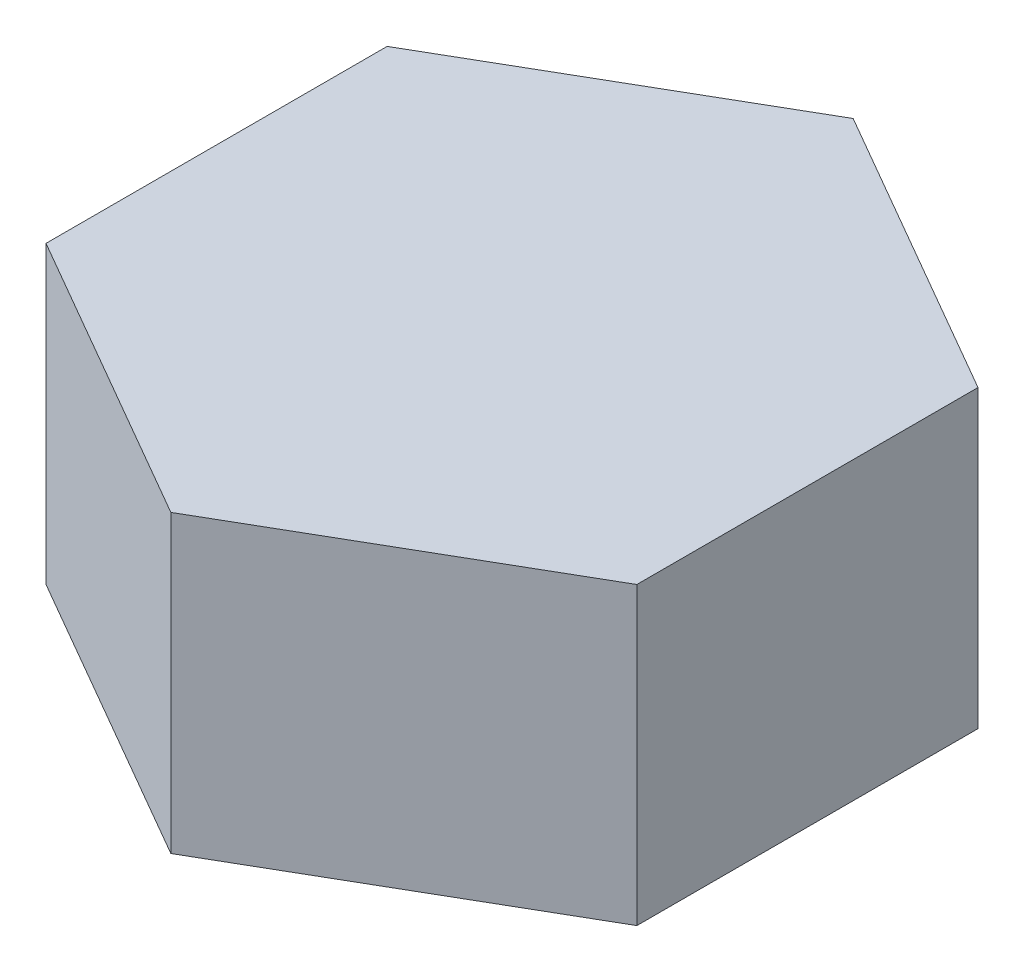
ISO-10303-21;
HEADER;
FILE_DESCRIPTION(('STEP AP214'),'2;1');
FILE_NAME('part.step','',(''),(''),'','','');
FILE_SCHEMA(('AUTOMOTIVE_DESIGN { 1 0 10303 214 1 1 1 1 }'));
ENDSEC;
DATA;
#1=APPLICATION_CONTEXT('core data for automotive mechanical design processes');
#2=APPLICATION_PROTOCOL_DEFINITION('international standard','automotive_design',2000,#1);
#3=PRODUCT_CONTEXT('',#1,'mechanical');
#4=PRODUCT('Part','Part','',(#3));
#5=PRODUCT_RELATED_PRODUCT_CATEGORY('part','',(#4));
#6=PRODUCT_DEFINITION_FORMATION('','',#4);
#7=PRODUCT_DEFINITION_CONTEXT('part definition',#1,'design');
#8=PRODUCT_DEFINITION('design','',#6,#7);
#9=PRODUCT_DEFINITION_SHAPE('','',#8);
#10=(LENGTH_UNIT() NAMED_UNIT(*) SI_UNIT(.MILLI.,.METRE.));
#11=(NAMED_UNIT(*) PLANE_ANGLE_UNIT() SI_UNIT($,.RADIAN.));
#12=(NAMED_UNIT(*) SI_UNIT($,.STERADIAN.) SOLID_ANGLE_UNIT());
#13=UNCERTAINTY_MEASURE_WITH_UNIT(LENGTH_MEASURE(1.E-05),#10,'distance_accuracy_value','');
#14=(GEOMETRIC_REPRESENTATION_CONTEXT(3) GLOBAL_UNCERTAINTY_ASSIGNED_CONTEXT((#13)) GLOBAL_UNIT_ASSIGNED_CONTEXT((#10,
#11,#12)) REPRESENTATION_CONTEXT('',''));
#15=CARTESIAN_POINT('',(0.,0.,0.));
#16=DIRECTION('',(0.,0.,1.));
#17=DIRECTION('',(1.,0.,0.));
#18=AXIS2_PLACEMENT_3D('',#15,#16,#17);
#19=CARTESIAN_POINT('',(50.7999999999998,50.8,29.3293936748337));
#20=DIRECTION('',(-1.,0.,0.));
#21=DIRECTION('',(0.,0.,1.));
#22=AXIS2_PLACEMENT_3D('',#19,#20,#21);
#23=PLANE('',#22);
#24=DIRECTION('',(0.,0.,-1.));
#25=VECTOR('',#24,1.);
#26=CARTESIAN_POINT('',(50.7999999999998,0.,29.3293936748337));
#27=LINE('',#26,#25);
#28=CARTESIAN_POINT('',(50.7999999999998,0.,29.3293936748337));
#29=VERTEX_POINT('',#28);
#30=CARTESIAN_POINT('',(50.8000000000006,0.,-29.3293936748325));
#31=VERTEX_POINT('',#30);
#32=EDGE_CURVE('E117',#29,#31,#27,.T.);
#33=ORIENTED_EDGE('',*,*,#32,.T.);
#34=DIRECTION('',(0.,-1.,0.));
#35=VECTOR('',#34,1.);
#36=CARTESIAN_POINT('',(50.8000000000006,50.8,-29.3293936748325));
#37=LINE('',#36,#35);
#38=CARTESIAN_POINT('',(50.8000000000006,50.8,-29.3293936748325));
#39=VERTEX_POINT('',#38);
#40=EDGE_CURVE('E11',#39,#31,#37,.T.);
#41=ORIENTED_EDGE('',*,*,#40,.F.);
#42=DIRECTION('',(0.,0.,-1.));
#43=VECTOR('',#42,1.);
#44=CARTESIAN_POINT('',(50.7999999999998,50.8,29.3293936748337));
#45=LINE('',#44,#43);
#46=CARTESIAN_POINT('',(50.7999999999998,50.8,29.3293936748337));
#47=VERTEX_POINT('',#46);
#48=EDGE_CURVE('E127',#47,#39,#45,.T.);
#49=ORIENTED_EDGE('',*,*,#48,.F.);
#50=DIRECTION('',(0.,-1.,0.));
#51=VECTOR('',#50,1.);
#52=CARTESIAN_POINT('',(50.7999999999998,50.8,29.3293936748337));
#53=LINE('',#52,#51);
#54=EDGE_CURVE('E113',#47,#29,#53,.T.);
#55=ORIENTED_EDGE('',*,*,#54,.T.);
#56=EDGE_LOOP('',(#33,#41,#49,#55));
#57=FACE_BOUND('',#56,.T.);
#58=ADVANCED_FACE('F33',(#57),#23,.F.);
#59=CARTESIAN_POINT('',(50.8000000000006,50.8,-29.3293936748325));
#60=DIRECTION('',(-0.500000000000011,0.,0.866025403784432));
#61=DIRECTION('',(0.866025403784433,0.,0.500000000000011));
#62=AXIS2_PLACEMENT_3D('',#59,#60,#61);
#63=PLANE('',#62);
#64=DIRECTION('',(-0.866025403784432,0.,-0.500000000000011));
#65=VECTOR('',#64,1.);
#66=CARTESIAN_POINT('',(50.8000000000006,0.,-29.3293936748325));
#67=LINE('',#66,#65);
#68=CARTESIAN_POINT('',(7.33001983763137E-13,0.,-58.6587873496662));
#69=VERTEX_POINT('',#68);
#70=EDGE_CURVE('E120',#31,#69,#67,.T.);
#71=ORIENTED_EDGE('',*,*,#70,.T.);
#72=DIRECTION('',(0.,-1.,0.));
#73=VECTOR('',#72,1.);
#74=CARTESIAN_POINT('',(7.33001983763137E-13,50.8,-58.6587873496662));
#75=LINE('',#74,#73);
#76=CARTESIAN_POINT('',(7.33001983763137E-13,50.8,-58.6587873496662));
#77=VERTEX_POINT('',#76);
#78=EDGE_CURVE('E41',#77,#69,#75,.T.);
#79=ORIENTED_EDGE('',*,*,#78,.F.);
#80=DIRECTION('',(-0.866025403784432,0.,-0.500000000000011));
#81=VECTOR('',#80,1.);
#82=CARTESIAN_POINT('',(50.8000000000006,50.8,-29.3293936748325));
#83=LINE('',#82,#81);
#84=EDGE_CURVE('E86',#39,#77,#83,.T.);
#85=ORIENTED_EDGE('',*,*,#84,.F.);
#86=ORIENTED_EDGE('',*,*,#40,.T.);
#87=EDGE_LOOP('',(#71,#79,#85,#86));
#88=FACE_BOUND('',#87,.T.);
#89=ADVANCED_FACE('F151',(#88),#63,.F.);
#90=CARTESIAN_POINT('',(7.33001983763137E-13,50.8,-58.6587873496662));
#91=DIRECTION('',(0.499999999999989,0.,0.866025403784445));
#92=DIRECTION('',(0.866025403784445,0.,-0.499999999999989));
#93=AXIS2_PLACEMENT_3D('',#90,#91,#92);
#94=PLANE('',#93);
#95=DIRECTION('',(-0.866025403784445,0.,0.499999999999989));
#96=VECTOR('',#95,1.);
#97=CARTESIAN_POINT('',(7.33001983763137E-13,0.,-58.6587873496662));
#98=LINE('',#97,#96);
#99=CARTESIAN_POINT('',(-50.7999999999998,0.,-29.3293936748338));
#100=VERTEX_POINT('',#99);
#101=EDGE_CURVE('E122',#69,#100,#98,.T.);
#102=ORIENTED_EDGE('',*,*,#101,.T.);
#103=DIRECTION('',(0.,-1.,0.));
#104=VECTOR('',#103,1.);
#105=CARTESIAN_POINT('',(-50.7999999999998,50.8,-29.3293936748338));
#106=LINE('',#105,#104);
#107=CARTESIAN_POINT('',(-50.7999999999998,50.8,-29.3293936748338));
#108=VERTEX_POINT('',#107);
#109=EDGE_CURVE('E108',#108,#100,#106,.T.);
#110=ORIENTED_EDGE('',*,*,#109,.F.);
#111=DIRECTION('',(-0.866025403784445,0.,0.499999999999989));
#112=VECTOR('',#111,1.);
#113=CARTESIAN_POINT('',(7.33001983763137E-13,50.8,-58.6587873496662));
#114=LINE('',#113,#112);
#115=EDGE_CURVE('E99',#77,#108,#114,.T.);
#116=ORIENTED_EDGE('',*,*,#115,.F.);
#117=ORIENTED_EDGE('',*,*,#78,.T.);
#118=EDGE_LOOP('',(#102,#110,#116,#117));
#119=FACE_BOUND('',#118,.T.);
#120=ADVANCED_FACE('F133',(#119),#94,.F.);
#121=CARTESIAN_POINT('',(-50.7999999999998,50.8,-29.3293936748338));
#122=DIRECTION('',(1.,0.,0.));
#123=DIRECTION('',(0.,0.,-1.));
#124=AXIS2_PLACEMENT_3D('',#121,#122,#123);
#125=PLANE('',#124);
#126=DIRECTION('',(0.,0.,1.));
#127=VECTOR('',#126,1.);
#128=CARTESIAN_POINT('',(-50.7999999999998,0.,-29.3293936748338));
#129=LINE('',#128,#127);
#130=CARTESIAN_POINT('',(-50.8000000000006,0.,29.3293936748325));
#131=VERTEX_POINT('',#130);
#132=EDGE_CURVE('E107',#100,#131,#129,.T.);
#133=ORIENTED_EDGE('',*,*,#132,.T.);
#134=DIRECTION('',(0.,-1.,0.));
#135=VECTOR('',#134,1.);
#136=CARTESIAN_POINT('',(-50.8000000000006,50.8,29.3293936748325));
#137=LINE('',#136,#135);
#138=CARTESIAN_POINT('',(-50.8000000000006,50.8,29.3293936748325));
#139=VERTEX_POINT('',#138);
#140=EDGE_CURVE('E104',#139,#131,#137,.T.);
#141=ORIENTED_EDGE('',*,*,#140,.F.);
#142=DIRECTION('',(0.,0.,1.));
#143=VECTOR('',#142,1.);
#144=CARTESIAN_POINT('',(-50.7999999999998,50.8,-29.3293936748338));
#145=LINE('',#144,#143);
#146=EDGE_CURVE('E93',#108,#139,#145,.T.);
#147=ORIENTED_EDGE('',*,*,#146,.F.);
#148=ORIENTED_EDGE('',*,*,#109,.T.);
#149=EDGE_LOOP('',(#133,#141,#147,#148));
#150=FACE_BOUND('',#149,.T.);
#151=ADVANCED_FACE('F105',(#150),#125,.F.);
#152=CARTESIAN_POINT('',(-50.8000000000006,50.8,29.3293936748325));
#153=DIRECTION('',(0.500000000000011,0.,-0.866025403784432));
#154=DIRECTION('',(-0.866025403784432,0.,-0.500000000000011));
#155=AXIS2_PLACEMENT_3D('',#152,#153,#154);
#156=PLANE('',#155);
#157=DIRECTION('',(0.866025403784432,0.,0.500000000000011));
#158=VECTOR('',#157,1.);
#159=CARTESIAN_POINT('',(-50.8000000000006,0.,29.3293936748325));
#160=LINE('',#159,#158);
#161=CARTESIAN_POINT('',(-7.78267424464407E-13,0.,58.6587873496662));
#162=VERTEX_POINT('',#161);
#163=EDGE_CURVE('E72',#131,#162,#160,.T.);
#164=ORIENTED_EDGE('',*,*,#163,.T.);
#165=DIRECTION('',(0.,-1.,0.));
#166=VECTOR('',#165,1.);
#167=CARTESIAN_POINT('',(-7.78267424464407E-13,50.8,58.6587873496662));
#168=LINE('',#167,#166);
#169=CARTESIAN_POINT('',(-7.78267424464407E-13,50.8,58.6587873496662));
#170=VERTEX_POINT('',#169);
#171=EDGE_CURVE('E109',#170,#162,#168,.T.);
#172=ORIENTED_EDGE('',*,*,#171,.F.);
#173=DIRECTION('',(0.866025403784432,0.,0.500000000000011));
#174=VECTOR('',#173,1.);
#175=CARTESIAN_POINT('',(-50.8000000000006,50.8,29.3293936748325));
#176=LINE('',#175,#174);
#177=EDGE_CURVE('E97',#139,#170,#176,.T.);
#178=ORIENTED_EDGE('',*,*,#177,.F.);
#179=ORIENTED_EDGE('',*,*,#140,.T.);
#180=EDGE_LOOP('',(#164,#172,#178,#179));
#181=FACE_BOUND('',#180,.T.);
#182=ADVANCED_FACE('F111',(#181),#156,.F.);
#183=CARTESIAN_POINT('',(-7.78267424464407E-13,50.8,58.6587873496662));
#184=DIRECTION('',(-0.499999999999989,0.,-0.866025403784445));
#185=DIRECTION('',(-0.866025403784445,0.,0.499999999999989));
#186=AXIS2_PLACEMENT_3D('',#183,#184,#185);
#187=PLANE('',#186);
#188=DIRECTION('',(0.866025403784445,0.,-0.499999999999989));
#189=VECTOR('',#188,1.);
#190=CARTESIAN_POINT('',(-7.78267424464407E-13,0.,58.6587873496662));
#191=LINE('',#190,#189);
#192=EDGE_CURVE('E78',#162,#29,#191,.T.);
#193=ORIENTED_EDGE('',*,*,#192,.T.);
#194=ORIENTED_EDGE('',*,*,#54,.F.);
#195=DIRECTION('',(0.866025403784445,0.,-0.499999999999989));
#196=VECTOR('',#195,1.);
#197=CARTESIAN_POINT('',(-7.78267424464407E-13,50.8,58.6587873496662));
#198=LINE('',#197,#196);
#199=EDGE_CURVE('E49',#170,#47,#198,.T.);
#200=ORIENTED_EDGE('',*,*,#199,.F.);
#201=ORIENTED_EDGE('',*,*,#171,.T.);
#202=EDGE_LOOP('',(#193,#194,#200,#201));
#203=FACE_BOUND('',#202,.T.);
#204=ADVANCED_FACE('F140',(#203),#187,.F.);
#205=CARTESIAN_POINT('',(0.,50.8,0.));
#206=DIRECTION('',(0.,1.,0.));
#207=DIRECTION('',(0.,0.,1.));
#208=AXIS2_PLACEMENT_3D('',#205,#206,#207);
#209=PLANE('',#208);
#210=ORIENTED_EDGE('',*,*,#48,.T.);
#211=ORIENTED_EDGE('',*,*,#84,.T.);
#212=ORIENTED_EDGE('',*,*,#115,.T.);
#213=ORIENTED_EDGE('',*,*,#146,.T.);
#214=ORIENTED_EDGE('',*,*,#177,.T.);
#215=ORIENTED_EDGE('',*,*,#199,.T.);
#216=EDGE_LOOP('',(#210,#211,#212,#213,#214,#215));
#217=FACE_BOUND('',#216,.T.);
#218=ADVANCED_FACE('F95',(#217),#209,.T.);
#219=CARTESIAN_POINT('',(0.,0.,0.));
#220=DIRECTION('',(0.,1.,0.));
#221=DIRECTION('',(0.,0.,1.));
#222=AXIS2_PLACEMENT_3D('',#219,#220,#221);
#223=PLANE('',#222);
#224=ORIENTED_EDGE('',*,*,#32,.F.);
#225=ORIENTED_EDGE('',*,*,#192,.F.);
#226=ORIENTED_EDGE('',*,*,#163,.F.);
#227=ORIENTED_EDGE('',*,*,#132,.F.);
#228=ORIENTED_EDGE('',*,*,#101,.F.);
#229=ORIENTED_EDGE('',*,*,#70,.F.);
#230=EDGE_LOOP('',(#224,#225,#226,#227,#228,#229));
#231=FACE_BOUND('',#230,.T.);
#232=ADVANCED_FACE('F136',(#231),#223,.F.);
#233=CLOSED_SHELL('',(#58,#89,#120,#151,#182,#204,#218,#232));
#234=MANIFOLD_SOLID_BREP('B2',#233);
#235=ADVANCED_BREP_SHAPE_REPRESENTATION('',(#18,#234),#14);
#236=SHAPE_DEFINITION_REPRESENTATION(#9,#235);
ENDSEC;
END-ISO-10303-21;
